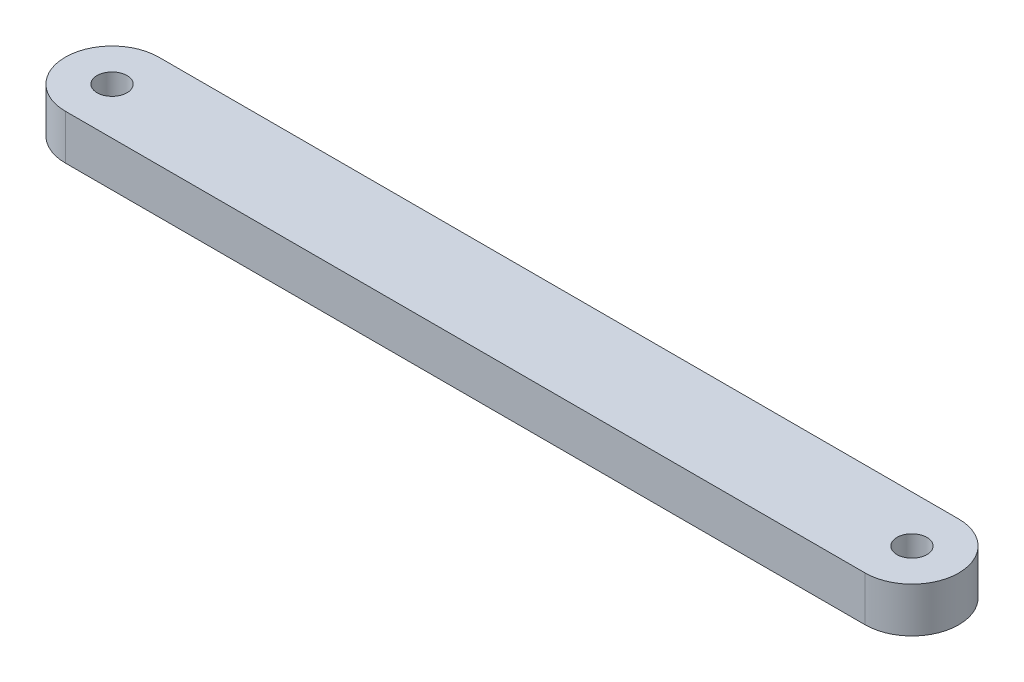
ISO-10303-21;
HEADER;
FILE_DESCRIPTION(('STEP AP214'),'2;1');
FILE_NAME('part.step','',(''),(''),'','','');
FILE_SCHEMA(('AUTOMOTIVE_DESIGN { 1 0 10303 214 1 1 1 1 }'));
ENDSEC;
DATA;
#1=APPLICATION_CONTEXT('core data for automotive mechanical design processes');
#2=APPLICATION_PROTOCOL_DEFINITION('international standard','automotive_design',2000,#1);
#3=PRODUCT_CONTEXT('',#1,'mechanical');
#4=PRODUCT('Part','Part','',(#3));
#5=PRODUCT_RELATED_PRODUCT_CATEGORY('part','',(#4));
#6=PRODUCT_DEFINITION_FORMATION('','',#4);
#7=PRODUCT_DEFINITION_CONTEXT('part definition',#1,'design');
#8=PRODUCT_DEFINITION('design','',#6,#7);
#9=PRODUCT_DEFINITION_SHAPE('','',#8);
#10=(LENGTH_UNIT() NAMED_UNIT(*) SI_UNIT(.MILLI.,.METRE.));
#11=(NAMED_UNIT(*) PLANE_ANGLE_UNIT() SI_UNIT($,.RADIAN.));
#12=(NAMED_UNIT(*) SI_UNIT($,.STERADIAN.) SOLID_ANGLE_UNIT());
#13=UNCERTAINTY_MEASURE_WITH_UNIT(LENGTH_MEASURE(1.E-05),#10,'distance_accuracy_value','');
#14=(GEOMETRIC_REPRESENTATION_CONTEXT(3) GLOBAL_UNCERTAINTY_ASSIGNED_CONTEXT((#13)) GLOBAL_UNIT_ASSIGNED_CONTEXT((#10,
#11,#12)) REPRESENTATION_CONTEXT('',''));
#15=CARTESIAN_POINT('',(0.,0.,0.));
#16=DIRECTION('',(0.,0.,1.));
#17=DIRECTION('',(1.,0.,0.));
#18=AXIS2_PLACEMENT_3D('',#15,#16,#17);
#19=CARTESIAN_POINT('',(-42.75,4.8,0.));
#20=DIRECTION('',(0.,1.,0.));
#21=DIRECTION('',(0.,0.,1.));
#22=AXIS2_PLACEMENT_3D('',#19,#20,#21);
#23=PLANE('',#22);
#24=CARTESIAN_POINT('',(-42.75,4.8,0.));
#25=DIRECTION('',(0.,1.,0.));
#26=DIRECTION('',(0.,0.,1.));
#27=AXIS2_PLACEMENT_3D('',#24,#25,#26);
#28=CIRCLE('',#27,1.6);
#29=CARTESIAN_POINT('',(-42.75,4.8,1.6));
#30=VERTEX_POINT('',#29);
#31=EDGE_CURVE('E100',#30,#30,#28,.T.);
#32=ORIENTED_EDGE('',*,*,#31,.F.);
#33=EDGE_LOOP('',(#32));
#34=FACE_BOUND('',#33,.T.);
#35=CARTESIAN_POINT('',(-42.75,4.8,0.));
#36=DIRECTION('',(0.,1.,0.));
#37=DIRECTION('',(0.,0.,1.));
#38=AXIS2_PLACEMENT_3D('',#35,#36,#37);
#39=CIRCLE('',#38,5.);
#40=CARTESIAN_POINT('',(-42.75,4.8,-5.));
#41=VERTEX_POINT('',#40);
#42=CARTESIAN_POINT('',(-42.75,4.8,5.));
#43=VERTEX_POINT('',#42);
#44=EDGE_CURVE('E85',#41,#43,#39,.T.);
#45=ORIENTED_EDGE('',*,*,#44,.T.);
#46=DIRECTION('',(1.,0.,0.));
#47=VECTOR('',#46,1.);
#48=CARTESIAN_POINT('',(-42.75,4.8,5.));
#49=LINE('',#48,#47);
#50=CARTESIAN_POINT('',(42.75,4.8,4.99999999999999));
#51=VERTEX_POINT('',#50);
#52=EDGE_CURVE('E80',#43,#51,#49,.T.);
#53=ORIENTED_EDGE('',*,*,#52,.T.);
#54=CARTESIAN_POINT('',(42.75,4.8,0.));
#55=DIRECTION('',(0.,1.,0.));
#56=DIRECTION('',(0.,0.,1.));
#57=AXIS2_PLACEMENT_3D('',#54,#55,#56);
#58=CIRCLE('',#57,5.);
#59=CARTESIAN_POINT('',(42.75,4.8,-5.00000000000002));
#60=VERTEX_POINT('',#59);
#61=EDGE_CURVE('E83',#51,#60,#58,.T.);
#62=ORIENTED_EDGE('',*,*,#61,.T.);
#63=DIRECTION('',(-1.,0.,0.));
#64=VECTOR('',#63,1.);
#65=CARTESIAN_POINT('',(-42.75,4.8,-5.));
#66=LINE('',#65,#64);
#67=EDGE_CURVE('E50',#60,#41,#66,.T.);
#68=ORIENTED_EDGE('',*,*,#67,.T.);
#69=EDGE_LOOP('',(#45,#53,#62,#68));
#70=FACE_BOUND('',#69,.T.);
#71=CARTESIAN_POINT('',(42.75,4.8,0.));
#72=DIRECTION('',(0.,1.,0.));
#73=DIRECTION('',(0.,0.,1.));
#74=AXIS2_PLACEMENT_3D('',#71,#72,#73);
#75=CIRCLE('',#74,1.6);
#76=CARTESIAN_POINT('',(42.75,4.8,1.59999999999998));
#77=VERTEX_POINT('',#76);
#78=EDGE_CURVE('E115',#77,#77,#75,.T.);
#79=ORIENTED_EDGE('',*,*,#78,.F.);
#80=EDGE_LOOP('',(#79));
#81=FACE_BOUND('',#80,.T.);
#82=ADVANCED_FACE('F33',(#34,#70,#81),#23,.T.);
#83=CARTESIAN_POINT('',(-42.75,0.,0.));
#84=DIRECTION('',(0.,1.,0.));
#85=DIRECTION('',(0.,0.,1.));
#86=AXIS2_PLACEMENT_3D('',#83,#84,#85);
#87=PLANE('',#86);
#88=CARTESIAN_POINT('',(-42.75,0.,0.));
#89=DIRECTION('',(0.,1.,0.));
#90=DIRECTION('',(0.,0.,1.));
#91=AXIS2_PLACEMENT_3D('',#88,#89,#90);
#92=CIRCLE('',#91,5.);
#93=CARTESIAN_POINT('',(-42.75,0.,-5.));
#94=VERTEX_POINT('',#93);
#95=CARTESIAN_POINT('',(-42.75,0.,5.));
#96=VERTEX_POINT('',#95);
#97=EDGE_CURVE('E97',#94,#96,#92,.T.);
#98=ORIENTED_EDGE('',*,*,#97,.F.);
#99=DIRECTION('',(-1.,0.,0.));
#100=VECTOR('',#99,1.);
#101=CARTESIAN_POINT('',(-42.75,0.,-5.));
#102=LINE('',#101,#100);
#103=CARTESIAN_POINT('',(42.75,0.,-5.00000000000002));
#104=VERTEX_POINT('',#103);
#105=EDGE_CURVE('E73',#104,#94,#102,.T.);
#106=ORIENTED_EDGE('',*,*,#105,.F.);
#107=CARTESIAN_POINT('',(42.75,0.,0.));
#108=DIRECTION('',(0.,1.,0.));
#109=DIRECTION('',(0.,0.,1.));
#110=AXIS2_PLACEMENT_3D('',#107,#108,#109);
#111=CIRCLE('',#110,5.);
#112=CARTESIAN_POINT('',(42.75,0.,4.99999999999999));
#113=VERTEX_POINT('',#112);
#114=EDGE_CURVE('E67',#113,#104,#111,.T.);
#115=ORIENTED_EDGE('',*,*,#114,.F.);
#116=DIRECTION('',(1.,0.,0.));
#117=VECTOR('',#116,1.);
#118=CARTESIAN_POINT('',(-42.75,0.,5.));
#119=LINE('',#118,#117);
#120=EDGE_CURVE('E89',#96,#113,#119,.T.);
#121=ORIENTED_EDGE('',*,*,#120,.F.);
#122=EDGE_LOOP('',(#98,#106,#115,#121));
#123=FACE_BOUND('',#122,.T.);
#124=CARTESIAN_POINT('',(-42.75,0.,0.));
#125=DIRECTION('',(0.,1.,0.));
#126=DIRECTION('',(0.,0.,1.));
#127=AXIS2_PLACEMENT_3D('',#124,#125,#126);
#128=CIRCLE('',#127,1.6);
#129=CARTESIAN_POINT('',(-42.75,0.,1.6));
#130=VERTEX_POINT('',#129);
#131=EDGE_CURVE('E112',#130,#130,#128,.T.);
#132=ORIENTED_EDGE('',*,*,#131,.T.);
#133=EDGE_LOOP('',(#132));
#134=FACE_BOUND('',#133,.T.);
#135=CARTESIAN_POINT('',(42.75,0.,0.));
#136=DIRECTION('',(0.,1.,0.));
#137=DIRECTION('',(0.,0.,1.));
#138=AXIS2_PLACEMENT_3D('',#135,#136,#137);
#139=CIRCLE('',#138,1.6);
#140=CARTESIAN_POINT('',(42.75,0.,1.59999999999998));
#141=VERTEX_POINT('',#140);
#142=EDGE_CURVE('E118',#141,#141,#139,.T.);
#143=ORIENTED_EDGE('',*,*,#142,.T.);
#144=EDGE_LOOP('',(#143));
#145=FACE_BOUND('',#144,.T.);
#146=ADVANCED_FACE('F108',(#123,#134,#145),#87,.F.);
#147=CARTESIAN_POINT('',(-42.75,4.8,0.));
#148=DIRECTION('',(0.,-1.,0.));
#149=DIRECTION('',(0.,0.,-1.));
#150=AXIS2_PLACEMENT_3D('',#147,#148,#149);
#151=CYLINDRICAL_SURFACE('',#150,5.);
#152=ORIENTED_EDGE('',*,*,#97,.T.);
#153=DIRECTION('',(0.,-1.,0.));
#154=VECTOR('',#153,1.);
#155=CARTESIAN_POINT('',(-42.75,4.8,5.));
#156=LINE('',#155,#154);
#157=EDGE_CURVE('E11',#43,#96,#156,.T.);
#158=ORIENTED_EDGE('',*,*,#157,.F.);
#159=ORIENTED_EDGE('',*,*,#44,.F.);
#160=DIRECTION('',(0.,-1.,0.));
#161=VECTOR('',#160,1.);
#162=CARTESIAN_POINT('',(-42.75,4.8,-5.));
#163=LINE('',#162,#161);
#164=EDGE_CURVE('E93',#41,#94,#163,.T.);
#165=ORIENTED_EDGE('',*,*,#164,.T.);
#166=EDGE_LOOP('',(#152,#158,#159,#165));
#167=FACE_BOUND('',#166,.T.);
#168=ADVANCED_FACE('F35',(#167),#151,.T.);
#169=CARTESIAN_POINT('',(-42.75,4.8,5.));
#170=DIRECTION('',(0.,0.,-1.));
#171=DIRECTION('',(-1.,0.,0.));
#172=AXIS2_PLACEMENT_3D('',#169,#170,#171);
#173=PLANE('',#172);
#174=ORIENTED_EDGE('',*,*,#120,.T.);
#175=DIRECTION('',(0.,-1.,0.));
#176=VECTOR('',#175,1.);
#177=CARTESIAN_POINT('',(42.75,4.8,4.99999999999999));
#178=LINE('',#177,#176);
#179=EDGE_CURVE('E42',#51,#113,#178,.T.);
#180=ORIENTED_EDGE('',*,*,#179,.F.);
#181=ORIENTED_EDGE('',*,*,#52,.F.);
#182=ORIENTED_EDGE('',*,*,#157,.T.);
#183=EDGE_LOOP('',(#174,#180,#181,#182));
#184=FACE_BOUND('',#183,.T.);
#185=ADVANCED_FACE('F88',(#184),#173,.F.);
#186=CARTESIAN_POINT('',(42.75,4.8,0.));
#187=DIRECTION('',(0.,-1.,0.));
#188=DIRECTION('',(0.,0.,-1.));
#189=AXIS2_PLACEMENT_3D('',#186,#187,#188);
#190=CYLINDRICAL_SURFACE('',#189,5.);
#191=ORIENTED_EDGE('',*,*,#114,.T.);
#192=DIRECTION('',(0.,-1.,0.));
#193=VECTOR('',#192,1.);
#194=CARTESIAN_POINT('',(42.75,4.8,-5.00000000000002));
#195=LINE('',#194,#193);
#196=EDGE_CURVE('E90',#60,#104,#195,.T.);
#197=ORIENTED_EDGE('',*,*,#196,.F.);
#198=ORIENTED_EDGE('',*,*,#61,.F.);
#199=ORIENTED_EDGE('',*,*,#179,.T.);
#200=EDGE_LOOP('',(#191,#197,#198,#199));
#201=FACE_BOUND('',#200,.T.);
#202=ADVANCED_FACE('F91',(#201),#190,.T.);
#203=CARTESIAN_POINT('',(-42.75,4.8,-5.));
#204=DIRECTION('',(0.,0.,1.));
#205=DIRECTION('',(1.,0.,0.));
#206=AXIS2_PLACEMENT_3D('',#203,#204,#205);
#207=PLANE('',#206);
#208=ORIENTED_EDGE('',*,*,#105,.T.);
#209=ORIENTED_EDGE('',*,*,#164,.F.);
#210=ORIENTED_EDGE('',*,*,#67,.F.);
#211=ORIENTED_EDGE('',*,*,#196,.T.);
#212=EDGE_LOOP('',(#208,#209,#210,#211));
#213=FACE_BOUND('',#212,.T.);
#214=ADVANCED_FACE('F105',(#213),#207,.F.);
#215=CARTESIAN_POINT('',(-42.75,4.8,0.));
#216=DIRECTION('',(0.,-1.,0.));
#217=DIRECTION('',(0.,0.,-1.));
#218=AXIS2_PLACEMENT_3D('',#215,#216,#217);
#219=CYLINDRICAL_SURFACE('',#218,1.6);
#220=ORIENTED_EDGE('',*,*,#31,.T.);
#221=EDGE_LOOP('',(#220));
#222=FACE_BOUND('',#221,.T.);
#223=ORIENTED_EDGE('',*,*,#131,.F.);
#224=EDGE_LOOP('',(#223));
#225=FACE_BOUND('',#224,.T.);
#226=ADVANCED_FACE('F135',(#222,#225),#219,.F.);
#227=CARTESIAN_POINT('',(42.75,4.8,0.));
#228=DIRECTION('',(0.,-1.,0.));
#229=DIRECTION('',(0.,0.,-1.));
#230=AXIS2_PLACEMENT_3D('',#227,#228,#229);
#231=CYLINDRICAL_SURFACE('',#230,1.6);
#232=ORIENTED_EDGE('',*,*,#78,.T.);
#233=EDGE_LOOP('',(#232));
#234=FACE_BOUND('',#233,.T.);
#235=ORIENTED_EDGE('',*,*,#142,.F.);
#236=EDGE_LOOP('',(#235));
#237=FACE_BOUND('',#236,.T.);
#238=ADVANCED_FACE('F124',(#234,#237),#231,.F.);
#239=CLOSED_SHELL('',(#82,#146,#168,#185,#202,#214,#226,#238));
#240=MANIFOLD_SOLID_BREP('B2',#239);
#241=ADVANCED_BREP_SHAPE_REPRESENTATION('',(#18,#240),#14);
#242=SHAPE_DEFINITION_REPRESENTATION(#9,#241);
ENDSEC;
END-ISO-10303-21;
